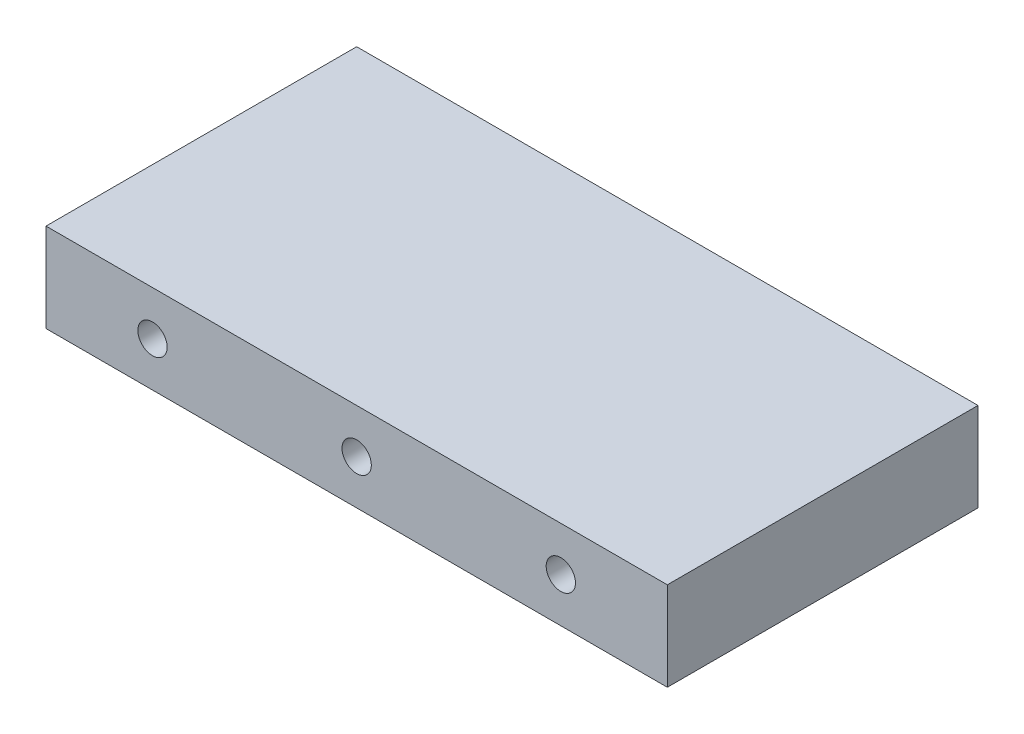
ISO-10303-21;
HEADER;
FILE_DESCRIPTION(('STEP AP214'),'2;1');
FILE_NAME('part.step','',(''),(''),'','','');
FILE_SCHEMA(('AUTOMOTIVE_DESIGN { 1 0 10303 214 1 1 1 1 }'));
ENDSEC;
DATA;
#1=APPLICATION_CONTEXT('core data for automotive mechanical design processes');
#2=APPLICATION_PROTOCOL_DEFINITION('international standard','automotive_design',2000,#1);
#3=PRODUCT_CONTEXT('',#1,'mechanical');
#4=PRODUCT('Part','Part','',(#3));
#5=PRODUCT_RELATED_PRODUCT_CATEGORY('part','',(#4));
#6=PRODUCT_DEFINITION_FORMATION('','',#4);
#7=PRODUCT_DEFINITION_CONTEXT('part definition',#1,'design');
#8=PRODUCT_DEFINITION('design','',#6,#7);
#9=PRODUCT_DEFINITION_SHAPE('','',#8);
#10=(LENGTH_UNIT() NAMED_UNIT(*) SI_UNIT(.MILLI.,.METRE.));
#11=(NAMED_UNIT(*) PLANE_ANGLE_UNIT() SI_UNIT($,.RADIAN.));
#12=(NAMED_UNIT(*) SI_UNIT($,.STERADIAN.) SOLID_ANGLE_UNIT());
#13=UNCERTAINTY_MEASURE_WITH_UNIT(LENGTH_MEASURE(1.E-05),#10,'distance_accuracy_value','');
#14=(GEOMETRIC_REPRESENTATION_CONTEXT(3) GLOBAL_UNCERTAINTY_ASSIGNED_CONTEXT((#13)) GLOBAL_UNIT_ASSIGNED_CONTEXT((#10,
#11,#12)) REPRESENTATION_CONTEXT('',''));
#15=CARTESIAN_POINT('',(0.,0.,0.));
#16=DIRECTION('',(0.,0.,1.));
#17=DIRECTION('',(1.,0.,0.));
#18=AXIS2_PLACEMENT_3D('',#15,#16,#17);
#19=CARTESIAN_POINT('',(35.,10.,-17.5));
#20=DIRECTION('',(0.,0.,1.));
#21=DIRECTION('',(1.,0.,0.));
#22=AXIS2_PLACEMENT_3D('',#19,#20,#21);
#23=PLANE('',#22);
#24=CARTESIAN_POINT('',(-23.,4.99999999999999,-17.5));
#25=DIRECTION('',(0.,0.,1.));
#26=DIRECTION('',(1.,0.,0.));
#27=AXIS2_PLACEMENT_3D('',#24,#25,#26);
#28=CIRCLE('',#27,1.65);
#29=CARTESIAN_POINT('',(-21.35,4.99999999999999,-17.5));
#30=VERTEX_POINT('',#29);
#31=EDGE_CURVE('E134',#30,#30,#28,.T.);
#32=ORIENTED_EDGE('',*,*,#31,.T.);
#33=EDGE_LOOP('',(#32));
#34=FACE_BOUND('',#33,.T.);
#35=DIRECTION('',(-1.,0.,0.));
#36=VECTOR('',#35,1.);
#37=CARTESIAN_POINT('',(35.,0.,-17.5));
#38=LINE('',#37,#36);
#39=CARTESIAN_POINT('',(35.,0.,-17.5));
#40=VERTEX_POINT('',#39);
#41=CARTESIAN_POINT('',(-35.,0.,-17.5));
#42=VERTEX_POINT('',#41);
#43=EDGE_CURVE('E72',#40,#42,#38,.T.);
#44=ORIENTED_EDGE('',*,*,#43,.T.);
#45=DIRECTION('',(0.,-1.,0.));
#46=VECTOR('',#45,1.);
#47=CARTESIAN_POINT('',(-35.,10.,-17.5));
#48=LINE('',#47,#46);
#49=CARTESIAN_POINT('',(-35.,10.,-17.5));
#50=VERTEX_POINT('',#49);
#51=EDGE_CURVE('E92',#50,#42,#48,.T.);
#52=ORIENTED_EDGE('',*,*,#51,.F.);
#53=DIRECTION('',(-1.,0.,0.));
#54=VECTOR('',#53,1.);
#55=CARTESIAN_POINT('',(35.,10.,-17.5));
#56=LINE('',#55,#54);
#57=CARTESIAN_POINT('',(35.,10.,-17.5));
#58=VERTEX_POINT('',#57);
#59=EDGE_CURVE('E49',#58,#50,#56,.T.);
#60=ORIENTED_EDGE('',*,*,#59,.F.);
#61=DIRECTION('',(0.,-1.,0.));
#62=VECTOR('',#61,1.);
#63=CARTESIAN_POINT('',(35.,10.,-17.5));
#64=LINE('',#63,#62);
#65=EDGE_CURVE('E89',#58,#40,#64,.T.);
#66=ORIENTED_EDGE('',*,*,#65,.T.);
#67=EDGE_LOOP('',(#44,#52,#60,#66));
#68=FACE_BOUND('',#67,.T.);
#69=CARTESIAN_POINT('',(0.,5.,-17.5));
#70=DIRECTION('',(0.,0.,1.));
#71=DIRECTION('',(1.,0.,0.));
#72=AXIS2_PLACEMENT_3D('',#69,#70,#71);
#73=CIRCLE('',#72,1.65);
#74=CARTESIAN_POINT('',(1.65,5.,-17.5));
#75=VERTEX_POINT('',#74);
#76=EDGE_CURVE('E128',#75,#75,#73,.T.);
#77=ORIENTED_EDGE('',*,*,#76,.T.);
#78=EDGE_LOOP('',(#77));
#79=FACE_BOUND('',#78,.T.);
#80=CARTESIAN_POINT('',(23.,4.99999999999999,-17.5));
#81=DIRECTION('',(0.,0.,1.));
#82=DIRECTION('',(-1.,0.,0.));
#83=AXIS2_PLACEMENT_3D('',#80,#81,#82);
#84=CIRCLE('',#83,1.65);
#85=CARTESIAN_POINT('',(21.35,4.99999999999999,-17.5));
#86=VERTEX_POINT('',#85);
#87=EDGE_CURVE('E140',#86,#86,#84,.T.);
#88=ORIENTED_EDGE('',*,*,#87,.T.);
#89=EDGE_LOOP('',(#88));
#90=FACE_BOUND('',#89,.T.);
#91=ADVANCED_FACE('F32',(#34,#68,#79,#90),#23,.F.);
#92=CARTESIAN_POINT('',(-35.,10.,17.5));
#93=DIRECTION('',(1.,0.,0.));
#94=DIRECTION('',(0.,0.,-1.));
#95=AXIS2_PLACEMENT_3D('',#92,#93,#94);
#96=PLANE('',#95);
#97=DIRECTION('',(0.,0.,1.));
#98=VECTOR('',#97,1.);
#99=CARTESIAN_POINT('',(-35.,0.,17.5));
#100=LINE('',#99,#98);
#101=CARTESIAN_POINT('',(-35.,0.,17.5));
#102=VERTEX_POINT('',#101);
#103=EDGE_CURVE('E96',#42,#102,#100,.T.);
#104=ORIENTED_EDGE('',*,*,#103,.T.);
#105=DIRECTION('',(0.,-1.,0.));
#106=VECTOR('',#105,1.);
#107=CARTESIAN_POINT('',(-35.,10.,17.5));
#108=LINE('',#107,#106);
#109=CARTESIAN_POINT('',(-35.,10.,17.5));
#110=VERTEX_POINT('',#109);
#111=EDGE_CURVE('E11',#110,#102,#108,.T.);
#112=ORIENTED_EDGE('',*,*,#111,.F.);
#113=DIRECTION('',(0.,0.,1.));
#114=VECTOR('',#113,1.);
#115=CARTESIAN_POINT('',(-35.,10.,17.5));
#116=LINE('',#115,#114);
#117=EDGE_CURVE('E84',#50,#110,#116,.T.);
#118=ORIENTED_EDGE('',*,*,#117,.F.);
#119=ORIENTED_EDGE('',*,*,#51,.T.);
#120=EDGE_LOOP('',(#104,#112,#118,#119));
#121=FACE_BOUND('',#120,.T.);
#122=ADVANCED_FACE('F34',(#121),#96,.F.);
#123=CARTESIAN_POINT('',(35.,10.,17.5));
#124=DIRECTION('',(0.,0.,-1.));
#125=DIRECTION('',(-1.,0.,0.));
#126=AXIS2_PLACEMENT_3D('',#123,#124,#125);
#127=PLANE('',#126);
#128=CARTESIAN_POINT('',(23.,4.99999999999999,17.5));
#129=DIRECTION('',(0.,0.,1.));
#130=DIRECTION('',(-1.,0.,0.));
#131=AXIS2_PLACEMENT_3D('',#128,#129,#130);
#132=CIRCLE('',#131,1.65);
#133=CARTESIAN_POINT('',(21.35,4.99999999999999,17.5));
#134=VERTEX_POINT('',#133);
#135=EDGE_CURVE('E122',#134,#134,#132,.T.);
#136=ORIENTED_EDGE('',*,*,#135,.F.);
#137=EDGE_LOOP('',(#136));
#138=FACE_BOUND('',#137,.T.);
#139=CARTESIAN_POINT('',(-23.,4.99999999999999,17.5));
#140=DIRECTION('',(0.,0.,1.));
#141=DIRECTION('',(1.,0.,0.));
#142=AXIS2_PLACEMENT_3D('',#139,#140,#141);
#143=CIRCLE('',#142,1.65);
#144=CARTESIAN_POINT('',(-21.35,4.99999999999999,17.5));
#145=VERTEX_POINT('',#144);
#146=EDGE_CURVE('E116',#145,#145,#143,.T.);
#147=ORIENTED_EDGE('',*,*,#146,.F.);
#148=EDGE_LOOP('',(#147));
#149=FACE_BOUND('',#148,.T.);
#150=CARTESIAN_POINT('',(0.,5.,17.5));
#151=DIRECTION('',(0.,0.,1.));
#152=DIRECTION('',(1.,0.,0.));
#153=AXIS2_PLACEMENT_3D('',#150,#151,#152);
#154=CIRCLE('',#153,1.65);
#155=CARTESIAN_POINT('',(1.65,5.,17.5));
#156=VERTEX_POINT('',#155);
#157=EDGE_CURVE('E110',#156,#156,#154,.T.);
#158=ORIENTED_EDGE('',*,*,#157,.F.);
#159=EDGE_LOOP('',(#158));
#160=FACE_BOUND('',#159,.T.);
#161=DIRECTION('',(1.,0.,0.));
#162=VECTOR('',#161,1.);
#163=CARTESIAN_POINT('',(35.,0.,17.5));
#164=LINE('',#163,#162);
#165=CARTESIAN_POINT('',(35.,0.,17.5));
#166=VERTEX_POINT('',#165);
#167=EDGE_CURVE('E88',#102,#166,#164,.T.);
#168=ORIENTED_EDGE('',*,*,#167,.T.);
#169=DIRECTION('',(0.,-1.,0.));
#170=VECTOR('',#169,1.);
#171=CARTESIAN_POINT('',(35.,10.,17.5));
#172=LINE('',#171,#170);
#173=CARTESIAN_POINT('',(35.,10.,17.5));
#174=VERTEX_POINT('',#173);
#175=EDGE_CURVE('E41',#174,#166,#172,.T.);
#176=ORIENTED_EDGE('',*,*,#175,.F.);
#177=DIRECTION('',(1.,0.,0.));
#178=VECTOR('',#177,1.);
#179=CARTESIAN_POINT('',(35.,10.,17.5));
#180=LINE('',#179,#178);
#181=EDGE_CURVE('E79',#110,#174,#180,.T.);
#182=ORIENTED_EDGE('',*,*,#181,.F.);
#183=ORIENTED_EDGE('',*,*,#111,.T.);
#184=EDGE_LOOP('',(#168,#176,#182,#183));
#185=FACE_BOUND('',#184,.T.);
#186=ADVANCED_FACE('F87',(#138,#149,#160,#185),#127,.F.);
#187=CARTESIAN_POINT('',(35.,10.,17.5));
#188=DIRECTION('',(-1.,0.,0.));
#189=DIRECTION('',(0.,0.,1.));
#190=AXIS2_PLACEMENT_3D('',#187,#188,#189);
#191=PLANE('',#190);
#192=DIRECTION('',(0.,0.,-1.));
#193=VECTOR('',#192,1.);
#194=CARTESIAN_POINT('',(35.,0.,17.5));
#195=LINE('',#194,#193);
#196=EDGE_CURVE('E66',#166,#40,#195,.T.);
#197=ORIENTED_EDGE('',*,*,#196,.T.);
#198=ORIENTED_EDGE('',*,*,#65,.F.);
#199=DIRECTION('',(0.,0.,-1.));
#200=VECTOR('',#199,1.);
#201=CARTESIAN_POINT('',(35.,10.,17.5));
#202=LINE('',#201,#200);
#203=EDGE_CURVE('E82',#174,#58,#202,.T.);
#204=ORIENTED_EDGE('',*,*,#203,.F.);
#205=ORIENTED_EDGE('',*,*,#175,.T.);
#206=EDGE_LOOP('',(#197,#198,#204,#205));
#207=FACE_BOUND('',#206,.T.);
#208=ADVANCED_FACE('F90',(#207),#191,.F.);
#209=CARTESIAN_POINT('',(-35.,10.,-17.5));
#210=DIRECTION('',(0.,1.,0.));
#211=DIRECTION('',(0.,0.,1.));
#212=AXIS2_PLACEMENT_3D('',#209,#210,#211);
#213=PLANE('',#212);
#214=ORIENTED_EDGE('',*,*,#117,.T.);
#215=ORIENTED_EDGE('',*,*,#181,.T.);
#216=ORIENTED_EDGE('',*,*,#203,.T.);
#217=ORIENTED_EDGE('',*,*,#59,.T.);
#218=EDGE_LOOP('',(#214,#215,#216,#217));
#219=FACE_BOUND('',#218,.T.);
#220=ADVANCED_FACE('F80',(#219),#213,.T.);
#221=CARTESIAN_POINT('',(-35.,0.,-17.5));
#222=DIRECTION('',(0.,1.,0.));
#223=DIRECTION('',(0.,0.,1.));
#224=AXIS2_PLACEMENT_3D('',#221,#222,#223);
#225=PLANE('',#224);
#226=ORIENTED_EDGE('',*,*,#103,.F.);
#227=ORIENTED_EDGE('',*,*,#43,.F.);
#228=ORIENTED_EDGE('',*,*,#196,.F.);
#229=ORIENTED_EDGE('',*,*,#167,.F.);
#230=EDGE_LOOP('',(#226,#227,#228,#229));
#231=FACE_BOUND('',#230,.T.);
#232=ADVANCED_FACE('F107',(#231),#225,.F.);
#233=CARTESIAN_POINT('',(0.,5.,7.5));
#234=DIRECTION('',(0.,0.,1.));
#235=DIRECTION('',(1.,0.,0.));
#236=AXIS2_PLACEMENT_3D('',#233,#234,#235);
#237=CYLINDRICAL_SURFACE('',#236,1.65);
#238=CARTESIAN_POINT('',(0.,5.,7.5));
#239=DIRECTION('',(0.,0.,1.));
#240=DIRECTION('',(1.,0.,0.));
#241=AXIS2_PLACEMENT_3D('',#238,#239,#240);
#242=CIRCLE('',#241,1.65);
#243=CARTESIAN_POINT('',(1.65,5.,7.5));
#244=VERTEX_POINT('',#243);
#245=EDGE_CURVE('E99',#244,#244,#242,.T.);
#246=ORIENTED_EDGE('',*,*,#245,.F.);
#247=EDGE_LOOP('',(#246));
#248=FACE_BOUND('',#247,.T.);
#249=ORIENTED_EDGE('',*,*,#157,.T.);
#250=EDGE_LOOP('',(#249));
#251=FACE_BOUND('',#250,.T.);
#252=ADVANCED_FACE('F177',(#248,#251),#237,.F.);
#253=CARTESIAN_POINT('',(0.,5.,7.5));
#254=DIRECTION('',(0.,0.,1.));
#255=DIRECTION('',(1.,0.,0.));
#256=AXIS2_PLACEMENT_3D('',#253,#254,#255);
#257=PLANE('',#256);
#258=ORIENTED_EDGE('',*,*,#245,.T.);
#259=EDGE_LOOP('',(#258));
#260=FACE_BOUND('',#259,.T.);
#261=ADVANCED_FACE('F179',(#260),#257,.T.);
#262=CARTESIAN_POINT('',(-23.,4.99999999999999,7.5));
#263=DIRECTION('',(0.,0.,1.));
#264=DIRECTION('',(1.,0.,0.));
#265=AXIS2_PLACEMENT_3D('',#262,#263,#264);
#266=CYLINDRICAL_SURFACE('',#265,1.65);
#267=CARTESIAN_POINT('',(-23.,4.99999999999999,7.5));
#268=DIRECTION('',(0.,0.,1.));
#269=DIRECTION('',(1.,0.,0.));
#270=AXIS2_PLACEMENT_3D('',#267,#268,#269);
#271=CIRCLE('',#270,1.65);
#272=CARTESIAN_POINT('',(-21.35,4.99999999999999,7.5));
#273=VERTEX_POINT('',#272);
#274=EDGE_CURVE('E113',#273,#273,#271,.T.);
#275=ORIENTED_EDGE('',*,*,#274,.F.);
#276=EDGE_LOOP('',(#275));
#277=FACE_BOUND('',#276,.T.);
#278=ORIENTED_EDGE('',*,*,#146,.T.);
#279=EDGE_LOOP('',(#278));
#280=FACE_BOUND('',#279,.T.);
#281=ADVANCED_FACE('F186',(#277,#280),#266,.F.);
#282=CARTESIAN_POINT('',(-23.,4.99999999999999,7.5));
#283=DIRECTION('',(0.,0.,1.));
#284=DIRECTION('',(1.,0.,0.));
#285=AXIS2_PLACEMENT_3D('',#282,#283,#284);
#286=PLANE('',#285);
#287=ORIENTED_EDGE('',*,*,#274,.T.);
#288=EDGE_LOOP('',(#287));
#289=FACE_BOUND('',#288,.T.);
#290=ADVANCED_FACE('F225',(#289),#286,.T.);
#291=CARTESIAN_POINT('',(23.,4.99999999999999,7.5));
#292=DIRECTION('',(0.,0.,1.));
#293=DIRECTION('',(1.,0.,0.));
#294=AXIS2_PLACEMENT_3D('',#291,#292,#293);
#295=CYLINDRICAL_SURFACE('',#294,1.65);
#296=CARTESIAN_POINT('',(23.,4.99999999999999,7.5));
#297=DIRECTION('',(0.,0.,1.));
#298=DIRECTION('',(-1.,0.,0.));
#299=AXIS2_PLACEMENT_3D('',#296,#297,#298);
#300=CIRCLE('',#299,1.65);
#301=CARTESIAN_POINT('',(21.35,4.99999999999999,7.5));
#302=VERTEX_POINT('',#301);
#303=EDGE_CURVE('E119',#302,#302,#300,.T.);
#304=ORIENTED_EDGE('',*,*,#303,.F.);
#305=EDGE_LOOP('',(#304));
#306=FACE_BOUND('',#305,.T.);
#307=ORIENTED_EDGE('',*,*,#135,.T.);
#308=EDGE_LOOP('',(#307));
#309=FACE_BOUND('',#308,.T.);
#310=ADVANCED_FACE('F234',(#306,#309),#295,.F.);
#311=CARTESIAN_POINT('',(23.,4.99999999999999,7.5));
#312=DIRECTION('',(0.,0.,-1.));
#313=DIRECTION('',(-1.,0.,0.));
#314=AXIS2_PLACEMENT_3D('',#311,#312,#313);
#315=PLANE('',#314);
#316=ORIENTED_EDGE('',*,*,#303,.T.);
#317=EDGE_LOOP('',(#316));
#318=FACE_BOUND('',#317,.T.);
#319=ADVANCED_FACE('F244',(#318),#315,.F.);
#320=CARTESIAN_POINT('',(0.,5.,-7.5));
#321=DIRECTION('',(0.,0.,-1.));
#322=DIRECTION('',(-1.,0.,0.));
#323=AXIS2_PLACEMENT_3D('',#320,#321,#322);
#324=CYLINDRICAL_SURFACE('',#323,1.65);
#325=CARTESIAN_POINT('',(0.,5.,-7.5));
#326=DIRECTION('',(0.,0.,1.));
#327=DIRECTION('',(1.,0.,0.));
#328=AXIS2_PLACEMENT_3D('',#325,#326,#327);
#329=CIRCLE('',#328,1.65);
#330=CARTESIAN_POINT('',(1.65,5.,-7.5));
#331=VERTEX_POINT('',#330);
#332=EDGE_CURVE('E125',#331,#331,#329,.T.);
#333=ORIENTED_EDGE('',*,*,#332,.T.);
#334=EDGE_LOOP('',(#333));
#335=FACE_BOUND('',#334,.T.);
#336=ORIENTED_EDGE('',*,*,#76,.F.);
#337=EDGE_LOOP('',(#336));
#338=FACE_BOUND('',#337,.T.);
#339=ADVANCED_FACE('F253',(#335,#338),#324,.F.);
#340=CARTESIAN_POINT('',(0.,5.,-7.5));
#341=DIRECTION('',(0.,0.,-1.));
#342=DIRECTION('',(1.,0.,0.));
#343=AXIS2_PLACEMENT_3D('',#340,#341,#342);
#344=PLANE('',#343);
#345=ORIENTED_EDGE('',*,*,#332,.F.);
#346=EDGE_LOOP('',(#345));
#347=FACE_BOUND('',#346,.T.);
#348=ADVANCED_FACE('F268',(#347),#344,.T.);
#349=CARTESIAN_POINT('',(-23.,4.99999999999999,-7.5));
#350=DIRECTION('',(0.,0.,-1.));
#351=DIRECTION('',(-1.,0.,0.));
#352=AXIS2_PLACEMENT_3D('',#349,#350,#351);
#353=CYLINDRICAL_SURFACE('',#352,1.65);
#354=CARTESIAN_POINT('',(-23.,4.99999999999999,-7.5));
#355=DIRECTION('',(0.,0.,1.));
#356=DIRECTION('',(1.,0.,0.));
#357=AXIS2_PLACEMENT_3D('',#354,#355,#356);
#358=CIRCLE('',#357,1.65);
#359=CARTESIAN_POINT('',(-21.35,4.99999999999999,-7.5));
#360=VERTEX_POINT('',#359);
#361=EDGE_CURVE('E131',#360,#360,#358,.T.);
#362=ORIENTED_EDGE('',*,*,#361,.T.);
#363=EDGE_LOOP('',(#362));
#364=FACE_BOUND('',#363,.T.);
#365=ORIENTED_EDGE('',*,*,#31,.F.);
#366=EDGE_LOOP('',(#365));
#367=FACE_BOUND('',#366,.T.);
#368=ADVANCED_FACE('F278',(#364,#367),#353,.F.);
#369=CARTESIAN_POINT('',(-23.,4.99999999999999,-7.5));
#370=DIRECTION('',(0.,0.,-1.));
#371=DIRECTION('',(1.,0.,0.));
#372=AXIS2_PLACEMENT_3D('',#369,#370,#371);
#373=PLANE('',#372);
#374=ORIENTED_EDGE('',*,*,#361,.F.);
#375=EDGE_LOOP('',(#374));
#376=FACE_BOUND('',#375,.T.);
#377=ADVANCED_FACE('F155',(#376),#373,.T.);
#378=CARTESIAN_POINT('',(23.,4.99999999999999,-7.5));
#379=DIRECTION('',(0.,0.,-1.));
#380=DIRECTION('',(-1.,0.,0.));
#381=AXIS2_PLACEMENT_3D('',#378,#379,#380);
#382=CYLINDRICAL_SURFACE('',#381,1.65);
#383=CARTESIAN_POINT('',(23.,4.99999999999999,-7.5));
#384=DIRECTION('',(0.,0.,1.));
#385=DIRECTION('',(-1.,0.,0.));
#386=AXIS2_PLACEMENT_3D('',#383,#384,#385);
#387=CIRCLE('',#386,1.65);
#388=CARTESIAN_POINT('',(21.35,4.99999999999999,-7.5));
#389=VERTEX_POINT('',#388);
#390=EDGE_CURVE('E137',#389,#389,#387,.T.);
#391=ORIENTED_EDGE('',*,*,#390,.T.);
#392=EDGE_LOOP('',(#391));
#393=FACE_BOUND('',#392,.T.);
#394=ORIENTED_EDGE('',*,*,#87,.F.);
#395=EDGE_LOOP('',(#394));
#396=FACE_BOUND('',#395,.T.);
#397=ADVANCED_FACE('F146',(#393,#396),#382,.F.);
#398=CARTESIAN_POINT('',(23.,4.99999999999999,-7.5));
#399=DIRECTION('',(0.,0.,1.));
#400=DIRECTION('',(-1.,0.,0.));
#401=AXIS2_PLACEMENT_3D('',#398,#399,#400);
#402=PLANE('',#401);
#403=ORIENTED_EDGE('',*,*,#390,.F.);
#404=EDGE_LOOP('',(#403));
#405=FACE_BOUND('',#404,.T.);
#406=ADVANCED_FACE('F149',(#405),#402,.F.);
#407=CLOSED_SHELL('',(#91,#122,#186,#208,#220,#232,#252,#261,#281,#290,#310,#319,#339,#348,#368,
#377,#397,#406));
#408=MANIFOLD_SOLID_BREP('B2',#407);
#409=ADVANCED_BREP_SHAPE_REPRESENTATION('',(#18,#408),#14);
#410=SHAPE_DEFINITION_REPRESENTATION(#9,#409);
ENDSEC;
END-ISO-10303-21;
